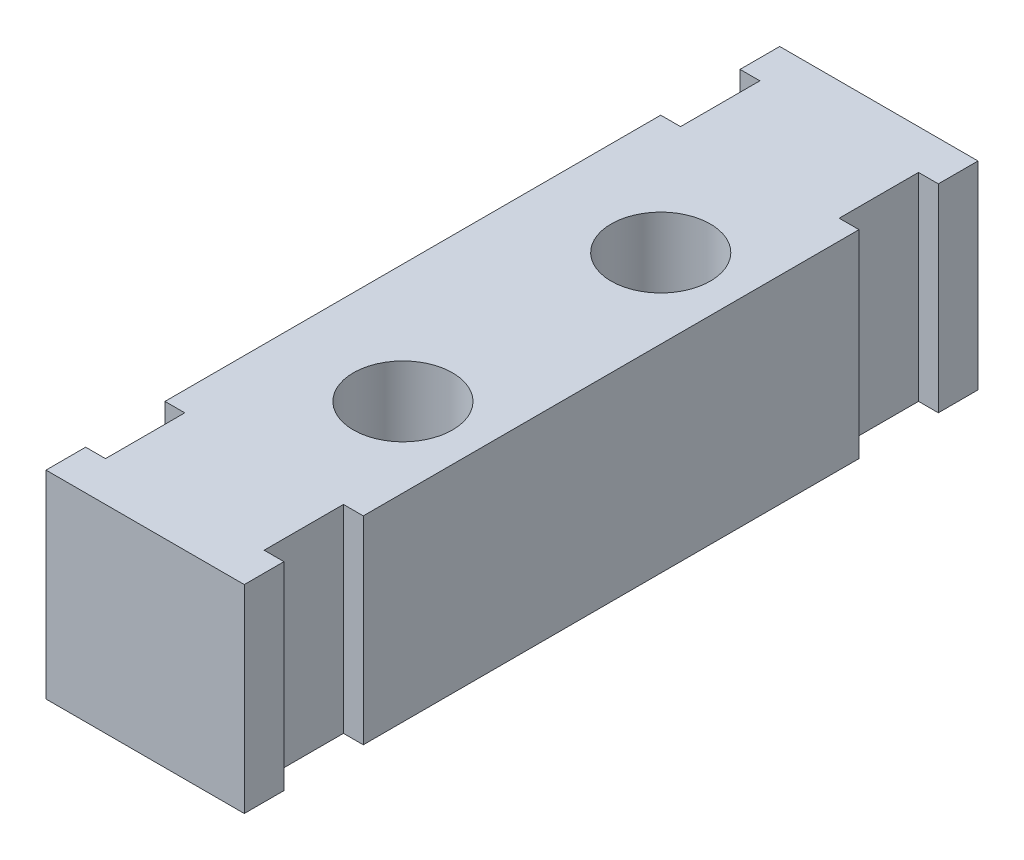
ISO-10303-21;
HEADER;
FILE_DESCRIPTION(('STEP AP214'),'2;1');
FILE_NAME('part.step','',(''),(''),'','','');
FILE_SCHEMA(('AUTOMOTIVE_DESIGN { 1 0 10303 214 1 1 1 1 }'));
ENDSEC;
DATA;
#1=APPLICATION_CONTEXT('core data for automotive mechanical design processes');
#2=APPLICATION_PROTOCOL_DEFINITION('international standard','automotive_design',2000,#1);
#3=PRODUCT_CONTEXT('',#1,'mechanical');
#4=PRODUCT('Part','Part','',(#3));
#5=PRODUCT_RELATED_PRODUCT_CATEGORY('part','',(#4));
#6=PRODUCT_DEFINITION_FORMATION('','',#4);
#7=PRODUCT_DEFINITION_CONTEXT('part definition',#1,'design');
#8=PRODUCT_DEFINITION('design','',#6,#7);
#9=PRODUCT_DEFINITION_SHAPE('','',#8);
#10=(LENGTH_UNIT() NAMED_UNIT(*) SI_UNIT(.MILLI.,.METRE.));
#11=(NAMED_UNIT(*) PLANE_ANGLE_UNIT() SI_UNIT($,.RADIAN.));
#12=(NAMED_UNIT(*) SI_UNIT($,.STERADIAN.) SOLID_ANGLE_UNIT());
#13=UNCERTAINTY_MEASURE_WITH_UNIT(LENGTH_MEASURE(1.E-05),#10,'distance_accuracy_value','');
#14=(GEOMETRIC_REPRESENTATION_CONTEXT(3) GLOBAL_UNCERTAINTY_ASSIGNED_CONTEXT((#13)) GLOBAL_UNIT_ASSIGNED_CONTEXT((#10,
#11,#12)) REPRESENTATION_CONTEXT('',''));
#15=CARTESIAN_POINT('',(0.,0.,0.));
#16=DIRECTION('',(0.,0.,1.));
#17=DIRECTION('',(1.,0.,0.));
#18=AXIS2_PLACEMENT_3D('',#15,#16,#17);
#19=CARTESIAN_POINT('',(5.,-5.,37.));
#20=DIRECTION('',(-1.,0.,0.));
#21=DIRECTION('',(0.,0.,1.));
#22=AXIS2_PLACEMENT_3D('',#19,#20,#21);
#23=PLANE('',#22);
#24=DIRECTION('',(0.,0.,-1.));
#25=VECTOR('',#24,1.);
#26=CARTESIAN_POINT('',(5.,-5.,37.));
#27=LINE('',#26,#25);
#28=CARTESIAN_POINT('',(5.,-5.,31.));
#29=VERTEX_POINT('',#28);
#30=CARTESIAN_POINT('',(5.,-5.,6.));
#31=VERTEX_POINT('',#30);
#32=EDGE_CURVE('E187',#29,#31,#27,.T.);
#33=ORIENTED_EDGE('',*,*,#32,.T.);
#34=DIRECTION('',(0.,1.,0.));
#35=VECTOR('',#34,1.);
#36=CARTESIAN_POINT('',(5.,-5.,6.));
#37=LINE('',#36,#35);
#38=CARTESIAN_POINT('',(5.,5.,6.));
#39=VERTEX_POINT('',#38);
#40=EDGE_CURVE('E320',#31,#39,#37,.T.);
#41=ORIENTED_EDGE('',*,*,#40,.T.);
#42=DIRECTION('',(0.,0.,-1.));
#43=VECTOR('',#42,1.);
#44=CARTESIAN_POINT('',(5.,5.,37.));
#45=LINE('',#44,#43);
#46=CARTESIAN_POINT('',(5.,5.,31.));
#47=VERTEX_POINT('',#46);
#48=EDGE_CURVE('E40',#47,#39,#45,.T.);
#49=ORIENTED_EDGE('',*,*,#48,.F.);
#50=DIRECTION('',(0.,1.,0.));
#51=VECTOR('',#50,1.);
#52=CARTESIAN_POINT('',(5.,-5.,31.));
#53=LINE('',#52,#51);
#54=EDGE_CURVE('E174',#29,#47,#53,.T.);
#55=ORIENTED_EDGE('',*,*,#54,.F.);
#56=EDGE_LOOP('',(#33,#41,#49,#55));
#57=FACE_BOUND('',#56,.T.);
#58=ADVANCED_FACE('F32',(#57),#23,.F.);
#59=CARTESIAN_POINT('',(5.,-5.,37.));
#60=VERTEX_POINT('',#59);
#61=CARTESIAN_POINT('',(5.,-5.,35.));
#62=VERTEX_POINT('',#61);
#63=EDGE_CURVE('E195',#60,#62,#27,.T.);
#64=ORIENTED_EDGE('',*,*,#63,.T.);
#65=DIRECTION('',(0.,1.,0.));
#66=VECTOR('',#65,1.);
#67=CARTESIAN_POINT('',(5.,-5.,35.));
#68=LINE('',#67,#66);
#69=CARTESIAN_POINT('',(5.,5.,35.));
#70=VERTEX_POINT('',#69);
#71=EDGE_CURVE('E283',#62,#70,#68,.T.);
#72=ORIENTED_EDGE('',*,*,#71,.T.);
#73=CARTESIAN_POINT('',(5.,5.,37.));
#74=VERTEX_POINT('',#73);
#75=EDGE_CURVE('E11',#74,#70,#45,.T.);
#76=ORIENTED_EDGE('',*,*,#75,.F.);
#77=DIRECTION('',(0.,1.,0.));
#78=VECTOR('',#77,1.);
#79=CARTESIAN_POINT('',(5.,-5.,37.));
#80=LINE('',#79,#78);
#81=EDGE_CURVE('E242',#60,#74,#80,.T.);
#82=ORIENTED_EDGE('',*,*,#81,.F.);
#83=EDGE_LOOP('',(#64,#72,#76,#82));
#84=FACE_BOUND('',#83,.T.);
#85=ADVANCED_FACE('F357',(#84),#23,.F.);
#86=CARTESIAN_POINT('',(-5.,-5.,37.));
#87=DIRECTION('',(1.,0.,0.));
#88=DIRECTION('',(0.,0.,-1.));
#89=AXIS2_PLACEMENT_3D('',#86,#87,#88);
#90=PLANE('',#89);
#91=DIRECTION('',(0.,0.,-1.));
#92=VECTOR('',#91,1.);
#93=CARTESIAN_POINT('',(-5.,-5.,37.));
#94=LINE('',#93,#92);
#95=CARTESIAN_POINT('',(-5.,-5.,2.));
#96=VERTEX_POINT('',#95);
#97=CARTESIAN_POINT('',(-5.,-5.,0.));
#98=VERTEX_POINT('',#97);
#99=EDGE_CURVE('E199',#96,#98,#94,.T.);
#100=ORIENTED_EDGE('',*,*,#99,.F.);
#101=DIRECTION('',(0.,1.,0.));
#102=VECTOR('',#101,1.);
#103=CARTESIAN_POINT('',(-5.,-5.,2.));
#104=LINE('',#103,#102);
#105=CARTESIAN_POINT('',(-5.,5.,2.));
#106=VERTEX_POINT('',#105);
#107=EDGE_CURVE('E227',#96,#106,#104,.T.);
#108=ORIENTED_EDGE('',*,*,#107,.T.);
#109=DIRECTION('',(0.,0.,-1.));
#110=VECTOR('',#109,1.);
#111=CARTESIAN_POINT('',(-5.,5.,37.));
#112=LINE('',#111,#110);
#113=CARTESIAN_POINT('',(-5.,5.,0.));
#114=VERTEX_POINT('',#113);
#115=EDGE_CURVE('E207',#106,#114,#112,.T.);
#116=ORIENTED_EDGE('',*,*,#115,.T.);
#117=DIRECTION('',(0.,-1.,0.));
#118=VECTOR('',#117,1.);
#119=CARTESIAN_POINT('',(-5.,-5.,0.));
#120=LINE('',#119,#118);
#121=EDGE_CURVE('E225',#114,#98,#120,.T.);
#122=ORIENTED_EDGE('',*,*,#121,.T.);
#123=EDGE_LOOP('',(#100,#108,#116,#122));
#124=FACE_BOUND('',#123,.T.);
#125=ADVANCED_FACE('F223',(#124),#90,.F.);
#126=CARTESIAN_POINT('',(-5.,5.,31.));
#127=VERTEX_POINT('',#126);
#128=CARTESIAN_POINT('',(-5.,5.,6.));
#129=VERTEX_POINT('',#128);
#130=EDGE_CURVE('E211',#127,#129,#112,.T.);
#131=ORIENTED_EDGE('',*,*,#130,.T.);
#132=DIRECTION('',(0.,1.,0.));
#133=VECTOR('',#132,1.);
#134=CARTESIAN_POINT('',(-5.,-5.,6.));
#135=LINE('',#134,#133);
#136=CARTESIAN_POINT('',(-5.,-5.,6.));
#137=VERTEX_POINT('',#136);
#138=EDGE_CURVE('E291',#137,#129,#135,.T.);
#139=ORIENTED_EDGE('',*,*,#138,.F.);
#140=CARTESIAN_POINT('',(-5.,-5.,31.));
#141=VERTEX_POINT('',#140);
#142=EDGE_CURVE('E208',#141,#137,#94,.T.);
#143=ORIENTED_EDGE('',*,*,#142,.F.);
#144=DIRECTION('',(0.,1.,0.));
#145=VECTOR('',#144,1.);
#146=CARTESIAN_POINT('',(-5.,-5.,31.));
#147=LINE('',#146,#145);
#148=EDGE_CURVE('E257',#141,#127,#147,.T.);
#149=ORIENTED_EDGE('',*,*,#148,.T.);
#150=EDGE_LOOP('',(#131,#139,#143,#149));
#151=FACE_BOUND('',#150,.T.);
#152=ADVANCED_FACE('F379',(#151),#90,.F.);
#153=CARTESIAN_POINT('',(5.,5.,2.));
#154=VERTEX_POINT('',#153);
#155=CARTESIAN_POINT('',(5.,5.,0.));
#156=VERTEX_POINT('',#155);
#157=EDGE_CURVE('E41',#154,#156,#45,.T.);
#158=ORIENTED_EDGE('',*,*,#157,.F.);
#159=DIRECTION('',(0.,1.,0.));
#160=VECTOR('',#159,1.);
#161=CARTESIAN_POINT('',(5.,-5.,2.));
#162=LINE('',#161,#160);
#163=CARTESIAN_POINT('',(5.,-5.,2.));
#164=VERTEX_POINT('',#163);
#165=EDGE_CURVE('E314',#164,#154,#162,.T.);
#166=ORIENTED_EDGE('',*,*,#165,.F.);
#167=CARTESIAN_POINT('',(5.,-5.,0.));
#168=VERTEX_POINT('',#167);
#169=EDGE_CURVE('E196',#164,#168,#27,.T.);
#170=ORIENTED_EDGE('',*,*,#169,.T.);
#171=DIRECTION('',(0.,1.,0.));
#172=VECTOR('',#171,1.);
#173=CARTESIAN_POINT('',(5.,-5.,0.));
#174=LINE('',#173,#172);
#175=EDGE_CURVE('E238',#168,#156,#174,.T.);
#176=ORIENTED_EDGE('',*,*,#175,.T.);
#177=EDGE_LOOP('',(#158,#166,#170,#176));
#178=FACE_BOUND('',#177,.T.);
#179=ADVANCED_FACE('F34',(#178),#23,.F.);
#180=CARTESIAN_POINT('',(-5.,5.,37.));
#181=DIRECTION('',(0.,-1.,0.));
#182=DIRECTION('',(0.,0.,-1.));
#183=AXIS2_PLACEMENT_3D('',#180,#181,#182);
#184=PLANE('',#183);
#185=CARTESIAN_POINT('',(1.,5.,12.));
#186=DIRECTION('',(0.,1.,0.));
#187=DIRECTION('',(0.,0.,1.));
#188=AXIS2_PLACEMENT_3D('',#185,#186,#187);
#189=CIRCLE('',#188,2.5);
#190=CARTESIAN_POINT('',(1.,5.,14.5));
#191=VERTEX_POINT('',#190);
#192=EDGE_CURVE('E260',#191,#191,#189,.T.);
#193=ORIENTED_EDGE('',*,*,#192,.F.);
#194=EDGE_LOOP('',(#193));
#195=FACE_BOUND('',#194,.T.);
#196=CARTESIAN_POINT('',(1.,5.,25.));
#197=DIRECTION('',(0.,1.,0.));
#198=DIRECTION('',(0.,0.,1.));
#199=AXIS2_PLACEMENT_3D('',#196,#197,#198);
#200=CIRCLE('',#199,2.5);
#201=CARTESIAN_POINT('',(1.,5.,27.5));
#202=VERTEX_POINT('',#201);
#203=EDGE_CURVE('E253',#202,#202,#200,.T.);
#204=ORIENTED_EDGE('',*,*,#203,.F.);
#205=EDGE_LOOP('',(#204));
#206=FACE_BOUND('',#205,.T.);
#207=ORIENTED_EDGE('',*,*,#115,.F.);
#208=DIRECTION('',(-1.,0.,0.));
#209=VECTOR('',#208,1.);
#210=CARTESIAN_POINT('',(-5.,5.,2.));
#211=LINE('',#210,#209);
#212=CARTESIAN_POINT('',(-4.,5.,2.));
#213=VERTEX_POINT('',#212);
#214=EDGE_CURVE('E300',#213,#106,#211,.T.);
#215=ORIENTED_EDGE('',*,*,#214,.F.);
#216=DIRECTION('',(0.,0.,-1.));
#217=VECTOR('',#216,1.);
#218=CARTESIAN_POINT('',(-4.,5.,6.));
#219=LINE('',#218,#217);
#220=CARTESIAN_POINT('',(-4.,5.,6.));
#221=VERTEX_POINT('',#220);
#222=EDGE_CURVE('E303',#221,#213,#219,.T.);
#223=ORIENTED_EDGE('',*,*,#222,.F.);
#224=DIRECTION('',(1.,0.,0.));
#225=VECTOR('',#224,1.);
#226=CARTESIAN_POINT('',(-5.,5.,6.));
#227=LINE('',#226,#225);
#228=EDGE_CURVE('E306',#129,#221,#227,.T.);
#229=ORIENTED_EDGE('',*,*,#228,.F.);
#230=ORIENTED_EDGE('',*,*,#130,.F.);
#231=DIRECTION('',(-1.,0.,0.));
#232=VECTOR('',#231,1.);
#233=CARTESIAN_POINT('',(-5.,5.,31.));
#234=LINE('',#233,#232);
#235=CARTESIAN_POINT('',(-4.,5.,31.));
#236=VERTEX_POINT('',#235);
#237=EDGE_CURVE('E274',#236,#127,#234,.T.);
#238=ORIENTED_EDGE('',*,*,#237,.F.);
#239=DIRECTION('',(0.,0.,-1.));
#240=VECTOR('',#239,1.);
#241=CARTESIAN_POINT('',(-4.,5.,35.));
#242=LINE('',#241,#240);
#243=CARTESIAN_POINT('',(-4.,5.,35.));
#244=VERTEX_POINT('',#243);
#245=EDGE_CURVE('E277',#244,#236,#242,.T.);
#246=ORIENTED_EDGE('',*,*,#245,.F.);
#247=DIRECTION('',(1.,0.,0.));
#248=VECTOR('',#247,1.);
#249=CARTESIAN_POINT('',(-5.,5.,35.));
#250=LINE('',#249,#248);
#251=CARTESIAN_POINT('',(-5.,5.,35.));
#252=VERTEX_POINT('',#251);
#253=EDGE_CURVE('E280',#252,#244,#250,.T.);
#254=ORIENTED_EDGE('',*,*,#253,.F.);
#255=CARTESIAN_POINT('',(-5.,5.,37.));
#256=VERTEX_POINT('',#255);
#257=EDGE_CURVE('E209',#256,#252,#112,.T.);
#258=ORIENTED_EDGE('',*,*,#257,.F.);
#259=DIRECTION('',(-1.,0.,0.));
#260=VECTOR('',#259,1.);
#261=CARTESIAN_POINT('',(-5.,5.,37.));
#262=LINE('',#261,#260);
#263=EDGE_CURVE('E249',#74,#256,#262,.T.);
#264=ORIENTED_EDGE('',*,*,#263,.F.);
#265=ORIENTED_EDGE('',*,*,#75,.T.);
#266=DIRECTION('',(1.,0.,0.));
#267=VECTOR('',#266,1.);
#268=CARTESIAN_POINT('',(5.,5.,35.));
#269=LINE('',#268,#267);
#270=CARTESIAN_POINT('',(4.,5.,35.));
#271=VERTEX_POINT('',#270);
#272=EDGE_CURVE('E181',#271,#70,#269,.T.);
#273=ORIENTED_EDGE('',*,*,#272,.F.);
#274=DIRECTION('',(0.,0.,1.));
#275=VECTOR('',#274,1.);
#276=CARTESIAN_POINT('',(4.,5.,35.));
#277=LINE('',#276,#275);
#278=CARTESIAN_POINT('',(4.,5.,31.));
#279=VERTEX_POINT('',#278);
#280=EDGE_CURVE('E341',#279,#271,#277,.T.);
#281=ORIENTED_EDGE('',*,*,#280,.F.);
#282=DIRECTION('',(-1.,0.,0.));
#283=VECTOR('',#282,1.);
#284=CARTESIAN_POINT('',(5.,5.,31.));
#285=LINE('',#284,#283);
#286=EDGE_CURVE('E322',#47,#279,#285,.T.);
#287=ORIENTED_EDGE('',*,*,#286,.F.);
#288=ORIENTED_EDGE('',*,*,#48,.T.);
#289=DIRECTION('',(1.,0.,0.));
#290=VECTOR('',#289,1.);
#291=CARTESIAN_POINT('',(5.,5.,6.));
#292=LINE('',#291,#290);
#293=CARTESIAN_POINT('',(4.,5.,6.));
#294=VERTEX_POINT('',#293);
#295=EDGE_CURVE('E323',#294,#39,#292,.T.);
#296=ORIENTED_EDGE('',*,*,#295,.F.);
#297=DIRECTION('',(0.,0.,1.));
#298=VECTOR('',#297,1.);
#299=CARTESIAN_POINT('',(4.,5.,6.));
#300=LINE('',#299,#298);
#301=CARTESIAN_POINT('',(4.,5.,2.));
#302=VERTEX_POINT('',#301);
#303=EDGE_CURVE('E326',#302,#294,#300,.T.);
#304=ORIENTED_EDGE('',*,*,#303,.F.);
#305=DIRECTION('',(-1.,0.,0.));
#306=VECTOR('',#305,1.);
#307=CARTESIAN_POINT('',(5.,5.,2.));
#308=LINE('',#307,#306);
#309=EDGE_CURVE('E299',#154,#302,#308,.T.);
#310=ORIENTED_EDGE('',*,*,#309,.F.);
#311=ORIENTED_EDGE('',*,*,#157,.T.);
#312=DIRECTION('',(-1.,0.,0.));
#313=VECTOR('',#312,1.);
#314=CARTESIAN_POINT('',(-5.,5.,0.));
#315=LINE('',#314,#313);
#316=EDGE_CURVE('E231',#156,#114,#315,.T.);
#317=ORIENTED_EDGE('',*,*,#316,.T.);
#318=EDGE_LOOP('',(#207,#215,#223,#229,#230,#238,#246,#254,#258,#264,#265,#273,#281,#287,#288,
#296,#304,#310,#311,#317));
#319=FACE_BOUND('',#318,.T.);
#320=ADVANCED_FACE('F232',(#195,#206,#319),#184,.F.);
#321=ORIENTED_EDGE('',*,*,#257,.T.);
#322=DIRECTION('',(0.,1.,0.));
#323=VECTOR('',#322,1.);
#324=CARTESIAN_POINT('',(-5.,-5.,35.));
#325=LINE('',#324,#323);
#326=CARTESIAN_POINT('',(-5.,-5.,35.));
#327=VERTEX_POINT('',#326);
#328=EDGE_CURVE('E265',#327,#252,#325,.T.);
#329=ORIENTED_EDGE('',*,*,#328,.F.);
#330=CARTESIAN_POINT('',(-5.,-5.,37.));
#331=VERTEX_POINT('',#330);
#332=EDGE_CURVE('E205',#331,#327,#94,.T.);
#333=ORIENTED_EDGE('',*,*,#332,.F.);
#334=DIRECTION('',(0.,-1.,0.));
#335=VECTOR('',#334,1.);
#336=CARTESIAN_POINT('',(-5.,-5.,37.));
#337=LINE('',#336,#335);
#338=EDGE_CURVE('E247',#256,#331,#337,.T.);
#339=ORIENTED_EDGE('',*,*,#338,.F.);
#340=EDGE_LOOP('',(#321,#329,#333,#339));
#341=FACE_BOUND('',#340,.T.);
#342=ADVANCED_FACE('F364',(#341),#90,.F.);
#343=CARTESIAN_POINT('',(-5.,-5.,37.));
#344=DIRECTION('',(0.,1.,0.));
#345=DIRECTION('',(0.,0.,1.));
#346=AXIS2_PLACEMENT_3D('',#343,#344,#345);
#347=PLANE('',#346);
#348=CARTESIAN_POINT('',(1.,-5.,12.));
#349=DIRECTION('',(0.,1.,0.));
#350=DIRECTION('',(0.,0.,1.));
#351=AXIS2_PLACEMENT_3D('',#348,#349,#350);
#352=CIRCLE('',#351,2.5);
#353=CARTESIAN_POINT('',(1.,-5.,14.5));
#354=VERTEX_POINT('',#353);
#355=EDGE_CURVE('E245',#354,#354,#352,.T.);
#356=ORIENTED_EDGE('',*,*,#355,.T.);
#357=EDGE_LOOP('',(#356));
#358=FACE_BOUND('',#357,.T.);
#359=CARTESIAN_POINT('',(1.,-5.,25.));
#360=DIRECTION('',(0.,1.,0.));
#361=DIRECTION('',(0.,0.,1.));
#362=AXIS2_PLACEMENT_3D('',#359,#360,#361);
#363=CIRCLE('',#362,2.5);
#364=CARTESIAN_POINT('',(1.,-5.,27.5));
#365=VERTEX_POINT('',#364);
#366=EDGE_CURVE('E256',#365,#365,#363,.T.);
#367=ORIENTED_EDGE('',*,*,#366,.T.);
#368=EDGE_LOOP('',(#367));
#369=FACE_BOUND('',#368,.T.);
#370=DIRECTION('',(0.,0.,-1.));
#371=VECTOR('',#370,1.);
#372=CARTESIAN_POINT('',(-4.,-5.,6.));
#373=LINE('',#372,#371);
#374=CARTESIAN_POINT('',(-4.,-5.,6.));
#375=VERTEX_POINT('',#374);
#376=CARTESIAN_POINT('',(-4.,-5.,2.));
#377=VERTEX_POINT('',#376);
#378=EDGE_CURVE('E48',#375,#377,#373,.T.);
#379=ORIENTED_EDGE('',*,*,#378,.T.);
#380=DIRECTION('',(-1.,0.,0.));
#381=VECTOR('',#380,1.);
#382=CARTESIAN_POINT('',(-5.,-5.,2.));
#383=LINE('',#382,#381);
#384=EDGE_CURVE('E294',#377,#96,#383,.T.);
#385=ORIENTED_EDGE('',*,*,#384,.T.);
#386=ORIENTED_EDGE('',*,*,#99,.T.);
#387=DIRECTION('',(1.,0.,0.));
#388=VECTOR('',#387,1.);
#389=CARTESIAN_POINT('',(-5.,-5.,0.));
#390=LINE('',#389,#388);
#391=EDGE_CURVE('E203',#98,#168,#390,.T.);
#392=ORIENTED_EDGE('',*,*,#391,.T.);
#393=ORIENTED_EDGE('',*,*,#169,.F.);
#394=DIRECTION('',(-1.,0.,0.));
#395=VECTOR('',#394,1.);
#396=CARTESIAN_POINT('',(5.,-5.,2.));
#397=LINE('',#396,#395);
#398=CARTESIAN_POINT('',(4.,-5.,2.));
#399=VERTEX_POINT('',#398);
#400=EDGE_CURVE('E325',#164,#399,#397,.T.);
#401=ORIENTED_EDGE('',*,*,#400,.T.);
#402=DIRECTION('',(0.,0.,1.));
#403=VECTOR('',#402,1.);
#404=CARTESIAN_POINT('',(4.,-5.,6.));
#405=LINE('',#404,#403);
#406=CARTESIAN_POINT('',(4.,-5.,6.));
#407=VERTEX_POINT('',#406);
#408=EDGE_CURVE('E56',#399,#407,#405,.T.);
#409=ORIENTED_EDGE('',*,*,#408,.T.);
#410=DIRECTION('',(1.,0.,0.));
#411=VECTOR('',#410,1.);
#412=CARTESIAN_POINT('',(5.,-5.,6.));
#413=LINE('',#412,#411);
#414=EDGE_CURVE('E194',#407,#31,#413,.T.);
#415=ORIENTED_EDGE('',*,*,#414,.T.);
#416=ORIENTED_EDGE('',*,*,#32,.F.);
#417=DIRECTION('',(-1.,0.,0.));
#418=VECTOR('',#417,1.);
#419=CARTESIAN_POINT('',(5.,-5.,31.));
#420=LINE('',#419,#418);
#421=CARTESIAN_POINT('',(4.,-5.,31.));
#422=VERTEX_POINT('',#421);
#423=EDGE_CURVE('E170',#29,#422,#420,.T.);
#424=ORIENTED_EDGE('',*,*,#423,.T.);
#425=DIRECTION('',(0.,0.,1.));
#426=VECTOR('',#425,1.);
#427=CARTESIAN_POINT('',(4.,-5.,35.));
#428=LINE('',#427,#426);
#429=CARTESIAN_POINT('',(4.,-5.,35.));
#430=VERTEX_POINT('',#429);
#431=EDGE_CURVE('E180',#422,#430,#428,.T.);
#432=ORIENTED_EDGE('',*,*,#431,.T.);
#433=DIRECTION('',(1.,0.,0.));
#434=VECTOR('',#433,1.);
#435=CARTESIAN_POINT('',(5.,-5.,35.));
#436=LINE('',#435,#434);
#437=EDGE_CURVE('E189',#430,#62,#436,.T.);
#438=ORIENTED_EDGE('',*,*,#437,.T.);
#439=ORIENTED_EDGE('',*,*,#63,.F.);
#440=DIRECTION('',(1.,0.,0.));
#441=VECTOR('',#440,1.);
#442=CARTESIAN_POINT('',(-5.,-5.,37.));
#443=LINE('',#442,#441);
#444=EDGE_CURVE('E200',#331,#60,#443,.T.);
#445=ORIENTED_EDGE('',*,*,#444,.F.);
#446=ORIENTED_EDGE('',*,*,#332,.T.);
#447=DIRECTION('',(1.,0.,0.));
#448=VECTOR('',#447,1.);
#449=CARTESIAN_POINT('',(-5.,-5.,35.));
#450=LINE('',#449,#448);
#451=CARTESIAN_POINT('',(-4.,-5.,35.));
#452=VERTEX_POINT('',#451);
#453=EDGE_CURVE('E276',#327,#452,#450,.T.);
#454=ORIENTED_EDGE('',*,*,#453,.T.);
#455=DIRECTION('',(0.,0.,-1.));
#456=VECTOR('',#455,1.);
#457=CARTESIAN_POINT('',(-4.,-5.,35.));
#458=LINE('',#457,#456);
#459=CARTESIAN_POINT('',(-4.,-5.,31.));
#460=VERTEX_POINT('',#459);
#461=EDGE_CURVE('E286',#452,#460,#458,.T.);
#462=ORIENTED_EDGE('',*,*,#461,.T.);
#463=DIRECTION('',(-1.,0.,0.));
#464=VECTOR('',#463,1.);
#465=CARTESIAN_POINT('',(-5.,-5.,31.));
#466=LINE('',#465,#464);
#467=EDGE_CURVE('E268',#460,#141,#466,.T.);
#468=ORIENTED_EDGE('',*,*,#467,.T.);
#469=ORIENTED_EDGE('',*,*,#142,.T.);
#470=DIRECTION('',(1.,0.,0.));
#471=VECTOR('',#470,1.);
#472=CARTESIAN_POINT('',(-5.,-5.,6.));
#473=LINE('',#472,#471);
#474=EDGE_CURVE('E302',#137,#375,#473,.T.);
#475=ORIENTED_EDGE('',*,*,#474,.T.);
#476=EDGE_LOOP('',(#379,#385,#386,#392,#393,#401,#409,#415,#416,#424,#432,#438,#439,#445,#446,
#454,#462,#468,#469,#475));
#477=FACE_BOUND('',#476,.T.);
#478=ADVANCED_FACE('F192',(#358,#369,#477),#347,.F.);
#479=CARTESIAN_POINT('',(0.,0.,37.));
#480=DIRECTION('',(0.,0.,-1.));
#481=DIRECTION('',(-1.,0.,0.));
#482=AXIS2_PLACEMENT_3D('',#479,#480,#481);
#483=PLANE('',#482);
#484=ORIENTED_EDGE('',*,*,#81,.T.);
#485=ORIENTED_EDGE('',*,*,#263,.T.);
#486=ORIENTED_EDGE('',*,*,#338,.T.);
#487=ORIENTED_EDGE('',*,*,#444,.T.);
#488=EDGE_LOOP('',(#484,#485,#486,#487));
#489=FACE_BOUND('',#488,.T.);
#490=ADVANCED_FACE('F361',(#489),#483,.F.);
#491=CARTESIAN_POINT('',(0.,0.,0.));
#492=DIRECTION('',(0.,0.,-1.));
#493=DIRECTION('',(-1.,0.,0.));
#494=AXIS2_PLACEMENT_3D('',#491,#492,#493);
#495=PLANE('',#494);
#496=ORIENTED_EDGE('',*,*,#175,.F.);
#497=ORIENTED_EDGE('',*,*,#391,.F.);
#498=ORIENTED_EDGE('',*,*,#121,.F.);
#499=ORIENTED_EDGE('',*,*,#316,.F.);
#500=EDGE_LOOP('',(#496,#497,#498,#499));
#501=FACE_BOUND('',#500,.T.);
#502=ADVANCED_FACE('F240',(#501),#495,.T.);
#503=CARTESIAN_POINT('',(1.,-5.,25.));
#504=DIRECTION('',(0.,1.,0.));
#505=DIRECTION('',(0.,0.,1.));
#506=AXIS2_PLACEMENT_3D('',#503,#504,#505);
#507=CYLINDRICAL_SURFACE('',#506,2.5);
#508=ORIENTED_EDGE('',*,*,#366,.F.);
#509=EDGE_LOOP('',(#508));
#510=FACE_BOUND('',#509,.T.);
#511=ORIENTED_EDGE('',*,*,#203,.T.);
#512=EDGE_LOOP('',(#511));
#513=FACE_BOUND('',#512,.T.);
#514=ADVANCED_FACE('F527',(#510,#513),#507,.F.);
#515=CARTESIAN_POINT('',(1.,-5.,12.));
#516=DIRECTION('',(0.,1.,0.));
#517=DIRECTION('',(0.,0.,1.));
#518=AXIS2_PLACEMENT_3D('',#515,#516,#517);
#519=CYLINDRICAL_SURFACE('',#518,2.5);
#520=ORIENTED_EDGE('',*,*,#355,.F.);
#521=EDGE_LOOP('',(#520));
#522=FACE_BOUND('',#521,.T.);
#523=ORIENTED_EDGE('',*,*,#192,.T.);
#524=EDGE_LOOP('',(#523));
#525=FACE_BOUND('',#524,.T.);
#526=ADVANCED_FACE('F499',(#522,#525),#519,.F.);
#527=CARTESIAN_POINT('',(-5.,-5.,31.));
#528=DIRECTION('',(0.,0.,-1.));
#529=DIRECTION('',(-1.,0.,0.));
#530=AXIS2_PLACEMENT_3D('',#527,#528,#529);
#531=PLANE('',#530);
#532=ORIENTED_EDGE('',*,*,#237,.T.);
#533=ORIENTED_EDGE('',*,*,#148,.F.);
#534=ORIENTED_EDGE('',*,*,#467,.F.);
#535=DIRECTION('',(0.,1.,0.));
#536=VECTOR('',#535,1.);
#537=CARTESIAN_POINT('',(-4.,-5.,31.));
#538=LINE('',#537,#536);
#539=EDGE_CURVE('E270',#460,#236,#538,.T.);
#540=ORIENTED_EDGE('',*,*,#539,.T.);
#541=EDGE_LOOP('',(#532,#533,#534,#540));
#542=FACE_BOUND('',#541,.T.);
#543=ADVANCED_FACE('F491',(#542),#531,.F.);
#544=CARTESIAN_POINT('',(-4.,-5.,35.));
#545=DIRECTION('',(1.,0.,0.));
#546=DIRECTION('',(0.,0.,-1.));
#547=AXIS2_PLACEMENT_3D('',#544,#545,#546);
#548=PLANE('',#547);
#549=ORIENTED_EDGE('',*,*,#245,.T.);
#550=ORIENTED_EDGE('',*,*,#539,.F.);
#551=ORIENTED_EDGE('',*,*,#461,.F.);
#552=DIRECTION('',(0.,1.,0.));
#553=VECTOR('',#552,1.);
#554=CARTESIAN_POINT('',(-4.,-5.,35.));
#555=LINE('',#554,#553);
#556=EDGE_CURVE('E267',#452,#244,#555,.T.);
#557=ORIENTED_EDGE('',*,*,#556,.T.);
#558=EDGE_LOOP('',(#549,#550,#551,#557));
#559=FACE_BOUND('',#558,.T.);
#560=ADVANCED_FACE('F372',(#559),#548,.F.);
#561=CARTESIAN_POINT('',(-5.,-5.,35.));
#562=DIRECTION('',(0.,0.,1.));
#563=DIRECTION('',(1.,0.,0.));
#564=AXIS2_PLACEMENT_3D('',#561,#562,#563);
#565=PLANE('',#564);
#566=ORIENTED_EDGE('',*,*,#253,.T.);
#567=ORIENTED_EDGE('',*,*,#556,.F.);
#568=ORIENTED_EDGE('',*,*,#453,.F.);
#569=ORIENTED_EDGE('',*,*,#328,.T.);
#570=EDGE_LOOP('',(#566,#567,#568,#569));
#571=FACE_BOUND('',#570,.T.);
#572=ADVANCED_FACE('F366',(#571),#565,.F.);
#573=CARTESIAN_POINT('',(5.,-5.,35.));
#574=DIRECTION('',(0.,0.,1.));
#575=DIRECTION('',(1.,0.,0.));
#576=AXIS2_PLACEMENT_3D('',#573,#574,#575);
#577=PLANE('',#576);
#578=ORIENTED_EDGE('',*,*,#272,.T.);
#579=ORIENTED_EDGE('',*,*,#71,.F.);
#580=ORIENTED_EDGE('',*,*,#437,.F.);
#581=DIRECTION('',(0.,1.,0.));
#582=VECTOR('',#581,1.);
#583=CARTESIAN_POINT('',(4.,-5.,35.));
#584=LINE('',#583,#582);
#585=EDGE_CURVE('E336',#430,#271,#584,.T.);
#586=ORIENTED_EDGE('',*,*,#585,.T.);
#587=EDGE_LOOP('',(#578,#579,#580,#586));
#588=FACE_BOUND('',#587,.T.);
#589=ADVANCED_FACE('F354',(#588),#577,.F.);
#590=CARTESIAN_POINT('',(4.,-5.,35.));
#591=DIRECTION('',(-1.,0.,0.));
#592=DIRECTION('',(0.,0.,1.));
#593=AXIS2_PLACEMENT_3D('',#590,#591,#592);
#594=PLANE('',#593);
#595=ORIENTED_EDGE('',*,*,#280,.T.);
#596=ORIENTED_EDGE('',*,*,#585,.F.);
#597=ORIENTED_EDGE('',*,*,#431,.F.);
#598=DIRECTION('',(0.,1.,0.));
#599=VECTOR('',#598,1.);
#600=CARTESIAN_POINT('',(4.,-5.,31.));
#601=LINE('',#600,#599);
#602=EDGE_CURVE('E176',#422,#279,#601,.T.);
#603=ORIENTED_EDGE('',*,*,#602,.T.);
#604=EDGE_LOOP('',(#595,#596,#597,#603));
#605=FACE_BOUND('',#604,.T.);
#606=ADVANCED_FACE('F350',(#605),#594,.F.);
#607=CARTESIAN_POINT('',(5.,-5.,31.));
#608=DIRECTION('',(0.,0.,-1.));
#609=DIRECTION('',(-1.,0.,0.));
#610=AXIS2_PLACEMENT_3D('',#607,#608,#609);
#611=PLANE('',#610);
#612=ORIENTED_EDGE('',*,*,#286,.T.);
#613=ORIENTED_EDGE('',*,*,#602,.F.);
#614=ORIENTED_EDGE('',*,*,#423,.F.);
#615=ORIENTED_EDGE('',*,*,#54,.T.);
#616=EDGE_LOOP('',(#612,#613,#614,#615));
#617=FACE_BOUND('',#616,.T.);
#618=ADVANCED_FACE('F173',(#617),#611,.F.);
#619=CARTESIAN_POINT('',(5.,-5.,6.));
#620=DIRECTION('',(0.,0.,1.));
#621=DIRECTION('',(1.,0.,0.));
#622=AXIS2_PLACEMENT_3D('',#619,#620,#621);
#623=PLANE('',#622);
#624=ORIENTED_EDGE('',*,*,#295,.T.);
#625=ORIENTED_EDGE('',*,*,#40,.F.);
#626=ORIENTED_EDGE('',*,*,#414,.F.);
#627=DIRECTION('',(0.,1.,0.));
#628=VECTOR('',#627,1.);
#629=CARTESIAN_POINT('',(4.,-5.,6.));
#630=LINE('',#629,#628);
#631=EDGE_CURVE('E318',#407,#294,#630,.T.);
#632=ORIENTED_EDGE('',*,*,#631,.T.);
#633=EDGE_LOOP('',(#624,#625,#626,#632));
#634=FACE_BOUND('',#633,.T.);
#635=ADVANCED_FACE('F415',(#634),#623,.F.);
#636=CARTESIAN_POINT('',(4.,-5.,6.));
#637=DIRECTION('',(-1.,0.,0.));
#638=DIRECTION('',(0.,0.,1.));
#639=AXIS2_PLACEMENT_3D('',#636,#637,#638);
#640=PLANE('',#639);
#641=ORIENTED_EDGE('',*,*,#303,.T.);
#642=ORIENTED_EDGE('',*,*,#631,.F.);
#643=ORIENTED_EDGE('',*,*,#408,.F.);
#644=DIRECTION('',(0.,1.,0.));
#645=VECTOR('',#644,1.);
#646=CARTESIAN_POINT('',(4.,-5.,2.));
#647=LINE('',#646,#645);
#648=EDGE_CURVE('E316',#399,#302,#647,.T.);
#649=ORIENTED_EDGE('',*,*,#648,.T.);
#650=EDGE_LOOP('',(#641,#642,#643,#649));
#651=FACE_BOUND('',#650,.T.);
#652=ADVANCED_FACE('F412',(#651),#640,.F.);
#653=CARTESIAN_POINT('',(5.,-5.,2.));
#654=DIRECTION('',(0.,0.,-1.));
#655=DIRECTION('',(-1.,0.,0.));
#656=AXIS2_PLACEMENT_3D('',#653,#654,#655);
#657=PLANE('',#656);
#658=ORIENTED_EDGE('',*,*,#309,.T.);
#659=ORIENTED_EDGE('',*,*,#648,.F.);
#660=ORIENTED_EDGE('',*,*,#400,.F.);
#661=ORIENTED_EDGE('',*,*,#165,.T.);
#662=EDGE_LOOP('',(#658,#659,#660,#661));
#663=FACE_BOUND('',#662,.T.);
#664=ADVANCED_FACE('F410',(#663),#657,.F.);
#665=CARTESIAN_POINT('',(-5.,-5.,2.));
#666=DIRECTION('',(0.,0.,-1.));
#667=DIRECTION('',(-1.,0.,0.));
#668=AXIS2_PLACEMENT_3D('',#665,#666,#667);
#669=PLANE('',#668);
#670=ORIENTED_EDGE('',*,*,#214,.T.);
#671=ORIENTED_EDGE('',*,*,#107,.F.);
#672=ORIENTED_EDGE('',*,*,#384,.F.);
#673=DIRECTION('',(0.,1.,0.));
#674=VECTOR('',#673,1.);
#675=CARTESIAN_POINT('',(-4.,-5.,2.));
#676=LINE('',#675,#674);
#677=EDGE_CURVE('E296',#377,#213,#676,.T.);
#678=ORIENTED_EDGE('',*,*,#677,.T.);
#679=EDGE_LOOP('',(#670,#671,#672,#678));
#680=FACE_BOUND('',#679,.T.);
#681=ADVANCED_FACE('F383',(#680),#669,.F.);
#682=CARTESIAN_POINT('',(-4.,-5.,6.));
#683=DIRECTION('',(1.,0.,0.));
#684=DIRECTION('',(0.,0.,-1.));
#685=AXIS2_PLACEMENT_3D('',#682,#683,#684);
#686=PLANE('',#685);
#687=ORIENTED_EDGE('',*,*,#222,.T.);
#688=ORIENTED_EDGE('',*,*,#677,.F.);
#689=ORIENTED_EDGE('',*,*,#378,.F.);
#690=DIRECTION('',(0.,1.,0.));
#691=VECTOR('',#690,1.);
#692=CARTESIAN_POINT('',(-4.,-5.,6.));
#693=LINE('',#692,#691);
#694=EDGE_CURVE('E293',#375,#221,#693,.T.);
#695=ORIENTED_EDGE('',*,*,#694,.T.);
#696=EDGE_LOOP('',(#687,#688,#689,#695));
#697=FACE_BOUND('',#696,.T.);
#698=ADVANCED_FACE('F386',(#697),#686,.F.);
#699=CARTESIAN_POINT('',(-5.,-5.,6.));
#700=DIRECTION('',(0.,0.,1.));
#701=DIRECTION('',(1.,0.,0.));
#702=AXIS2_PLACEMENT_3D('',#699,#700,#701);
#703=PLANE('',#702);
#704=ORIENTED_EDGE('',*,*,#228,.T.);
#705=ORIENTED_EDGE('',*,*,#694,.F.);
#706=ORIENTED_EDGE('',*,*,#474,.F.);
#707=ORIENTED_EDGE('',*,*,#138,.T.);
#708=EDGE_LOOP('',(#704,#705,#706,#707));
#709=FACE_BOUND('',#708,.T.);
#710=ADVANCED_FACE('F388',(#709),#703,.F.);
#711=CLOSED_SHELL('',(#58,#85,#125,#152,#179,#320,#342,#478,#490,#502,#514,#526,#543,#560,#572,
#589,#606,#618,#635,#652,#664,#681,#698,#710));
#712=MANIFOLD_SOLID_BREP('B2',#711);
#713=ADVANCED_BREP_SHAPE_REPRESENTATION('',(#18,#712),#14);
#714=SHAPE_DEFINITION_REPRESENTATION(#9,#713);
ENDSEC;
END-ISO-10303-21;
